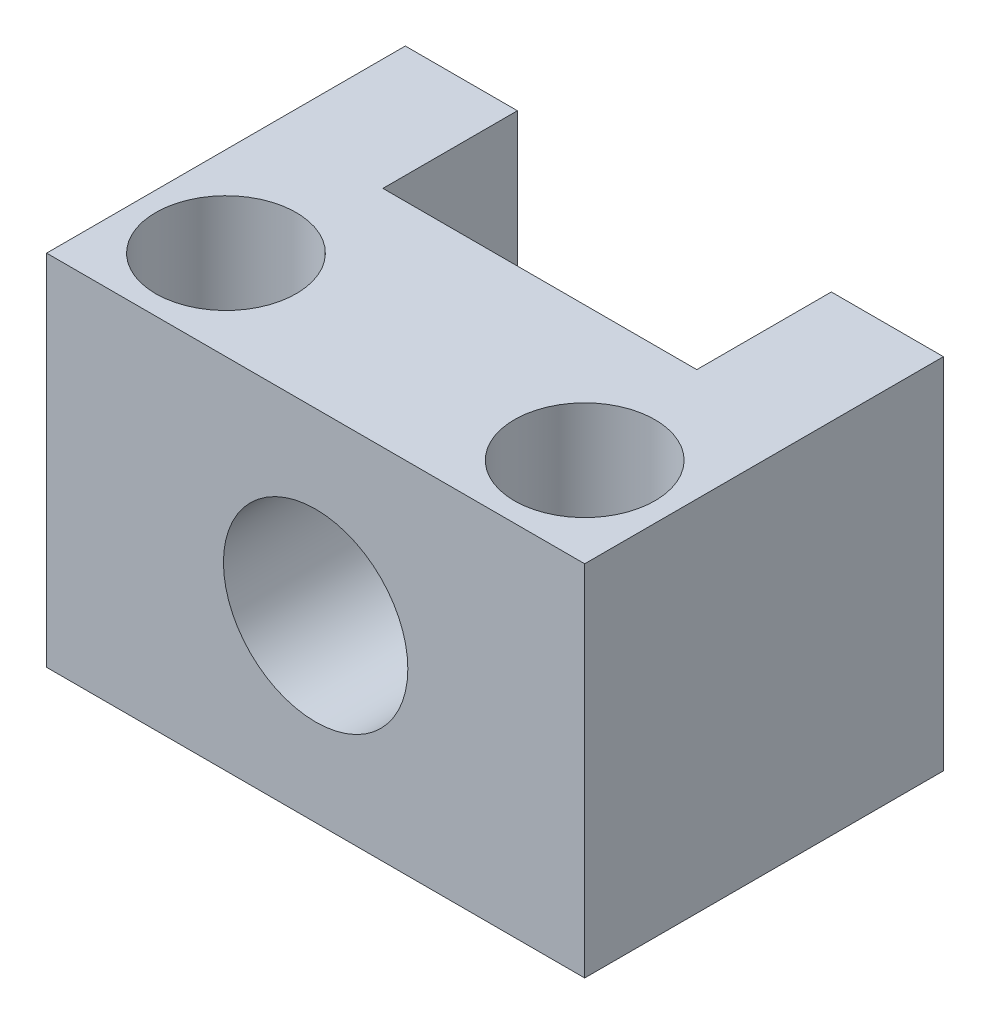
ISO-10303-21;
HEADER;
FILE_DESCRIPTION(('STEP AP214'),'2;1');
FILE_NAME('part.step','',(''),(''),'','','');
FILE_SCHEMA(('AUTOMOTIVE_DESIGN { 1 0 10303 214 1 1 1 1 }'));
ENDSEC;
DATA;
#1=APPLICATION_CONTEXT('core data for automotive mechanical design processes');
#2=APPLICATION_PROTOCOL_DEFINITION('international standard','automotive_design',2000,#1);
#3=PRODUCT_CONTEXT('',#1,'mechanical');
#4=PRODUCT('Part','Part','',(#3));
#5=PRODUCT_RELATED_PRODUCT_CATEGORY('part','',(#4));
#6=PRODUCT_DEFINITION_FORMATION('','',#4);
#7=PRODUCT_DEFINITION_CONTEXT('part definition',#1,'design');
#8=PRODUCT_DEFINITION('design','',#6,#7);
#9=PRODUCT_DEFINITION_SHAPE('','',#8);
#10=(LENGTH_UNIT() NAMED_UNIT(*) SI_UNIT(.MILLI.,.METRE.));
#11=(NAMED_UNIT(*) PLANE_ANGLE_UNIT() SI_UNIT($,.RADIAN.));
#12=(NAMED_UNIT(*) SI_UNIT($,.STERADIAN.) SOLID_ANGLE_UNIT());
#13=UNCERTAINTY_MEASURE_WITH_UNIT(LENGTH_MEASURE(1.E-05),#10,'distance_accuracy_value','');
#14=(GEOMETRIC_REPRESENTATION_CONTEXT(3) GLOBAL_UNCERTAINTY_ASSIGNED_CONTEXT((#13)) GLOBAL_UNIT_ASSIGNED_CONTEXT((#10,
#11,#12)) REPRESENTATION_CONTEXT('',''));
#15=CARTESIAN_POINT('',(0.,0.,0.));
#16=DIRECTION('',(0.,0.,1.));
#17=DIRECTION('',(1.,0.,0.));
#18=AXIS2_PLACEMENT_3D('',#15,#16,#17);
#19=CARTESIAN_POINT('',(0.,12.7,-12.7));
#20=DIRECTION('',(0.,0.,1.));
#21=DIRECTION('',(1.,0.,0.));
#22=AXIS2_PLACEMENT_3D('',#19,#20,#21);
#23=PLANE('',#22);
#24=DIRECTION('',(-1.,0.,0.));
#25=VECTOR('',#24,1.);
#26=CARTESIAN_POINT('',(0.,0.,-12.7));
#27=LINE('',#26,#25);
#28=CARTESIAN_POINT('',(19.05,0.,-12.7));
#29=VERTEX_POINT('',#28);
#30=CARTESIAN_POINT('',(15.08125,0.,-12.7));
#31=VERTEX_POINT('',#30);
#32=EDGE_CURVE('E131',#29,#31,#27,.T.);
#33=ORIENTED_EDGE('',*,*,#32,.T.);
#34=DIRECTION('',(0.,1.,0.));
#35=VECTOR('',#34,1.);
#36=CARTESIAN_POINT('',(15.08125,0.,-12.7));
#37=LINE('',#36,#35);
#38=CARTESIAN_POINT('',(15.08125,12.7,-12.7));
#39=VERTEX_POINT('',#38);
#40=EDGE_CURVE('E115',#31,#39,#37,.T.);
#41=ORIENTED_EDGE('',*,*,#40,.T.);
#42=DIRECTION('',(-1.,0.,0.));
#43=VECTOR('',#42,1.);
#44=CARTESIAN_POINT('',(0.,12.7,-12.7));
#45=LINE('',#44,#43);
#46=CARTESIAN_POINT('',(19.05,12.7,-12.7));
#47=VERTEX_POINT('',#46);
#48=EDGE_CURVE('E148',#47,#39,#45,.T.);
#49=ORIENTED_EDGE('',*,*,#48,.F.);
#50=DIRECTION('',(0.,-1.,0.));
#51=VECTOR('',#50,1.);
#52=CARTESIAN_POINT('',(19.05,12.7,-12.7));
#53=LINE('',#52,#51);
#54=EDGE_CURVE('E138',#47,#29,#53,.T.);
#55=ORIENTED_EDGE('',*,*,#54,.T.);
#56=EDGE_LOOP('',(#33,#41,#49,#55));
#57=FACE_BOUND('',#56,.T.);
#58=ADVANCED_FACE('F39',(#57),#23,.F.);
#59=CARTESIAN_POINT('',(0.,12.7,0.));
#60=DIRECTION('',(1.,0.,0.));
#61=DIRECTION('',(0.,0.,-1.));
#62=AXIS2_PLACEMENT_3D('',#59,#60,#61);
#63=PLANE('',#62);
#64=DIRECTION('',(0.,0.,1.));
#65=VECTOR('',#64,1.);
#66=CARTESIAN_POINT('',(0.,0.,0.));
#67=LINE('',#66,#65);
#68=CARTESIAN_POINT('',(0.,0.,-12.7));
#69=VERTEX_POINT('',#68);
#70=CARTESIAN_POINT('',(0.,0.,0.));
#71=VERTEX_POINT('',#70);
#72=EDGE_CURVE('E157',#69,#71,#67,.T.);
#73=ORIENTED_EDGE('',*,*,#72,.T.);
#74=DIRECTION('',(0.,-1.,0.));
#75=VECTOR('',#74,1.);
#76=CARTESIAN_POINT('',(0.,12.7,0.));
#77=LINE('',#76,#75);
#78=CARTESIAN_POINT('',(0.,12.7,0.));
#79=VERTEX_POINT('',#78);
#80=EDGE_CURVE('E11',#79,#71,#77,.T.);
#81=ORIENTED_EDGE('',*,*,#80,.F.);
#82=DIRECTION('',(0.,0.,1.));
#83=VECTOR('',#82,1.);
#84=CARTESIAN_POINT('',(0.,12.7,0.));
#85=LINE('',#84,#83);
#86=CARTESIAN_POINT('',(0.,12.7,-12.7));
#87=VERTEX_POINT('',#86);
#88=EDGE_CURVE('E139',#87,#79,#85,.T.);
#89=ORIENTED_EDGE('',*,*,#88,.F.);
#90=DIRECTION('',(0.,-1.,0.));
#91=VECTOR('',#90,1.);
#92=CARTESIAN_POINT('',(0.,12.7,-12.7));
#93=LINE('',#92,#91);
#94=EDGE_CURVE('E146',#87,#69,#93,.T.);
#95=ORIENTED_EDGE('',*,*,#94,.T.);
#96=EDGE_LOOP('',(#73,#81,#89,#95));
#97=FACE_BOUND('',#96,.T.);
#98=ADVANCED_FACE('F41',(#97),#63,.F.);
#99=CARTESIAN_POINT('',(0.,12.7,0.));
#100=DIRECTION('',(0.,0.,-1.));
#101=DIRECTION('',(-1.,0.,0.));
#102=AXIS2_PLACEMENT_3D('',#99,#100,#101);
#103=PLANE('',#102);
#104=CARTESIAN_POINT('',(9.525,6.35,0.));
#105=DIRECTION('',(0.,0.,1.));
#106=DIRECTION('',(1.,0.,0.));
#107=AXIS2_PLACEMENT_3D('',#104,#105,#106);
#108=CIRCLE('',#107,3.2639);
#109=CARTESIAN_POINT('',(12.7889,6.35,0.));
#110=VERTEX_POINT('',#109);
#111=EDGE_CURVE('E189',#110,#110,#108,.T.);
#112=ORIENTED_EDGE('',*,*,#111,.F.);
#113=EDGE_LOOP('',(#112));
#114=FACE_BOUND('',#113,.T.);
#115=DIRECTION('',(1.,0.,0.));
#116=VECTOR('',#115,1.);
#117=CARTESIAN_POINT('',(0.,0.,0.));
#118=LINE('',#117,#116);
#119=CARTESIAN_POINT('',(19.05,0.,0.));
#120=VERTEX_POINT('',#119);
#121=EDGE_CURVE('E156',#71,#120,#118,.T.);
#122=ORIENTED_EDGE('',*,*,#121,.T.);
#123=DIRECTION('',(0.,-1.,0.));
#124=VECTOR('',#123,1.);
#125=CARTESIAN_POINT('',(19.05,12.7,0.));
#126=LINE('',#125,#124);
#127=CARTESIAN_POINT('',(19.05,12.7,0.));
#128=VERTEX_POINT('',#127);
#129=EDGE_CURVE('E48',#128,#120,#126,.T.);
#130=ORIENTED_EDGE('',*,*,#129,.F.);
#131=DIRECTION('',(1.,0.,0.));
#132=VECTOR('',#131,1.);
#133=CARTESIAN_POINT('',(0.,12.7,0.));
#134=LINE('',#133,#132);
#135=EDGE_CURVE('E93',#79,#128,#134,.T.);
#136=ORIENTED_EDGE('',*,*,#135,.F.);
#137=ORIENTED_EDGE('',*,*,#80,.T.);
#138=EDGE_LOOP('',(#122,#130,#136,#137));
#139=FACE_BOUND('',#138,.T.);
#140=ADVANCED_FACE('F217',(#114,#139),#103,.F.);
#141=CARTESIAN_POINT('',(19.05,12.7,0.));
#142=DIRECTION('',(-1.,0.,0.));
#143=DIRECTION('',(0.,0.,1.));
#144=AXIS2_PLACEMENT_3D('',#141,#142,#143);
#145=PLANE('',#144);
#146=DIRECTION('',(0.,0.,-1.));
#147=VECTOR('',#146,1.);
#148=CARTESIAN_POINT('',(19.05,0.,0.));
#149=LINE('',#148,#147);
#150=EDGE_CURVE('E142',#120,#29,#149,.T.);
#151=ORIENTED_EDGE('',*,*,#150,.T.);
#152=ORIENTED_EDGE('',*,*,#54,.F.);
#153=DIRECTION('',(0.,0.,-1.));
#154=VECTOR('',#153,1.);
#155=CARTESIAN_POINT('',(19.05,12.7,0.));
#156=LINE('',#155,#154);
#157=EDGE_CURVE('E154',#128,#47,#156,.T.);
#158=ORIENTED_EDGE('',*,*,#157,.F.);
#159=ORIENTED_EDGE('',*,*,#129,.T.);
#160=EDGE_LOOP('',(#151,#152,#158,#159));
#161=FACE_BOUND('',#160,.T.);
#162=ADVANCED_FACE('F153',(#161),#145,.F.);
#163=CARTESIAN_POINT('',(3.96875,12.7,-12.7));
#164=VERTEX_POINT('',#163);
#165=EDGE_CURVE('E64',#164,#87,#45,.T.);
#166=ORIENTED_EDGE('',*,*,#165,.F.);
#167=DIRECTION('',(0.,1.,0.));
#168=VECTOR('',#167,1.);
#169=CARTESIAN_POINT('',(3.96875,0.,-12.7));
#170=LINE('',#169,#168);
#171=CARTESIAN_POINT('',(3.96875,0.,-12.7));
#172=VERTEX_POINT('',#171);
#173=EDGE_CURVE('E125',#172,#164,#170,.T.);
#174=ORIENTED_EDGE('',*,*,#173,.F.);
#175=EDGE_CURVE('E86',#172,#69,#27,.T.);
#176=ORIENTED_EDGE('',*,*,#175,.T.);
#177=ORIENTED_EDGE('',*,*,#94,.F.);
#178=EDGE_LOOP('',(#166,#174,#176,#177));
#179=FACE_BOUND('',#178,.T.);
#180=ADVANCED_FACE('F211',(#179),#23,.F.);
#181=CARTESIAN_POINT('',(0.,12.7,0.));
#182=DIRECTION('',(0.,-1.,0.));
#183=DIRECTION('',(0.,0.,-1.));
#184=AXIS2_PLACEMENT_3D('',#181,#182,#183);
#185=PLANE('',#184);
#186=CARTESIAN_POINT('',(15.875,12.7,-3.175));
#187=DIRECTION('',(0.,1.,0.));
#188=DIRECTION('',(0.,0.,1.));
#189=AXIS2_PLACEMENT_3D('',#186,#187,#188);
#190=CIRCLE('',#189,2.4892);
#191=CARTESIAN_POINT('',(15.875,12.7,-0.685800000000002));
#192=VERTEX_POINT('',#191);
#193=EDGE_CURVE('E184',#192,#192,#190,.T.);
#194=ORIENTED_EDGE('',*,*,#193,.F.);
#195=EDGE_LOOP('',(#194));
#196=FACE_BOUND('',#195,.T.);
#197=CARTESIAN_POINT('',(3.175,12.7,-3.175));
#198=DIRECTION('',(0.,1.,0.));
#199=DIRECTION('',(0.,0.,1.));
#200=AXIS2_PLACEMENT_3D('',#197,#198,#199);
#201=CIRCLE('',#200,2.4892);
#202=CARTESIAN_POINT('',(3.175,12.7,-0.685800000000002));
#203=VERTEX_POINT('',#202);
#204=EDGE_CURVE('E178',#203,#203,#201,.T.);
#205=ORIENTED_EDGE('',*,*,#204,.F.);
#206=EDGE_LOOP('',(#205));
#207=FACE_BOUND('',#206,.T.);
#208=ORIENTED_EDGE('',*,*,#48,.T.);
#209=DIRECTION('',(0.,0.,-1.));
#210=VECTOR('',#209,1.);
#211=CARTESIAN_POINT('',(15.08125,12.7,-7.9375));
#212=LINE('',#211,#210);
#213=CARTESIAN_POINT('',(15.08125,12.7,-7.9375));
#214=VERTEX_POINT('',#213);
#215=EDGE_CURVE('E120',#214,#39,#212,.T.);
#216=ORIENTED_EDGE('',*,*,#215,.F.);
#217=DIRECTION('',(1.,0.,0.));
#218=VECTOR('',#217,1.);
#219=CARTESIAN_POINT('',(3.96875,12.7,-7.9375));
#220=LINE('',#219,#218);
#221=CARTESIAN_POINT('',(3.96875,12.7,-7.9375));
#222=VERTEX_POINT('',#221);
#223=EDGE_CURVE('E134',#222,#214,#220,.T.);
#224=ORIENTED_EDGE('',*,*,#223,.F.);
#225=DIRECTION('',(0.,0.,1.));
#226=VECTOR('',#225,1.);
#227=CARTESIAN_POINT('',(3.96875,12.7,-7.9375));
#228=LINE('',#227,#226);
#229=EDGE_CURVE('E171',#164,#222,#228,.T.);
#230=ORIENTED_EDGE('',*,*,#229,.F.);
#231=ORIENTED_EDGE('',*,*,#165,.T.);
#232=ORIENTED_EDGE('',*,*,#88,.T.);
#233=ORIENTED_EDGE('',*,*,#135,.T.);
#234=ORIENTED_EDGE('',*,*,#157,.T.);
#235=EDGE_LOOP('',(#208,#216,#224,#230,#231,#232,#233,#234));
#236=FACE_BOUND('',#235,.T.);
#237=ADVANCED_FACE('F221',(#196,#207,#236),#185,.F.);
#238=CARTESIAN_POINT('',(0.,0.,0.));
#239=DIRECTION('',(0.,-1.,0.));
#240=DIRECTION('',(0.,0.,-1.));
#241=AXIS2_PLACEMENT_3D('',#238,#239,#240);
#242=PLANE('',#241);
#243=CARTESIAN_POINT('',(15.875,0.,-3.175));
#244=DIRECTION('',(0.,1.,0.));
#245=DIRECTION('',(0.,0.,1.));
#246=AXIS2_PLACEMENT_3D('',#243,#244,#245);
#247=CIRCLE('',#246,2.4892);
#248=CARTESIAN_POINT('',(15.875,0.,-0.685800000000002));
#249=VERTEX_POINT('',#248);
#250=EDGE_CURVE('E181',#249,#249,#247,.T.);
#251=ORIENTED_EDGE('',*,*,#250,.T.);
#252=EDGE_LOOP('',(#251));
#253=FACE_BOUND('',#252,.T.);
#254=CARTESIAN_POINT('',(3.175,0.,-3.175));
#255=DIRECTION('',(0.,1.,0.));
#256=DIRECTION('',(0.,0.,1.));
#257=AXIS2_PLACEMENT_3D('',#254,#255,#256);
#258=CIRCLE('',#257,2.4892);
#259=CARTESIAN_POINT('',(3.175,0.,-0.685800000000002));
#260=VERTEX_POINT('',#259);
#261=EDGE_CURVE('E175',#260,#260,#258,.T.);
#262=ORIENTED_EDGE('',*,*,#261,.T.);
#263=EDGE_LOOP('',(#262));
#264=FACE_BOUND('',#263,.T.);
#265=DIRECTION('',(0.,0.,-1.));
#266=VECTOR('',#265,1.);
#267=CARTESIAN_POINT('',(15.08125,0.,-7.9375));
#268=LINE('',#267,#266);
#269=CARTESIAN_POINT('',(15.08125,0.,-7.9375));
#270=VERTEX_POINT('',#269);
#271=EDGE_CURVE('E118',#270,#31,#268,.T.);
#272=ORIENTED_EDGE('',*,*,#271,.T.);
#273=ORIENTED_EDGE('',*,*,#32,.F.);
#274=ORIENTED_EDGE('',*,*,#150,.F.);
#275=ORIENTED_EDGE('',*,*,#121,.F.);
#276=ORIENTED_EDGE('',*,*,#72,.F.);
#277=ORIENTED_EDGE('',*,*,#175,.F.);
#278=DIRECTION('',(0.,0.,1.));
#279=VECTOR('',#278,1.);
#280=CARTESIAN_POINT('',(3.96875,0.,-7.9375));
#281=LINE('',#280,#279);
#282=CARTESIAN_POINT('',(3.96875,0.,-7.9375));
#283=VERTEX_POINT('',#282);
#284=EDGE_CURVE('E133',#172,#283,#281,.T.);
#285=ORIENTED_EDGE('',*,*,#284,.T.);
#286=DIRECTION('',(1.,0.,0.));
#287=VECTOR('',#286,1.);
#288=CARTESIAN_POINT('',(3.96875,0.,-7.9375));
#289=LINE('',#288,#287);
#290=EDGE_CURVE('E55',#283,#270,#289,.T.);
#291=ORIENTED_EDGE('',*,*,#290,.T.);
#292=EDGE_LOOP('',(#272,#273,#274,#275,#276,#277,#285,#291));
#293=FACE_BOUND('',#292,.T.);
#294=ADVANCED_FACE('F129',(#253,#264,#293),#242,.T.);
#295=CARTESIAN_POINT('',(15.08125,0.,-7.9375));
#296=DIRECTION('',(1.,0.,0.));
#297=DIRECTION('',(0.,0.,-1.));
#298=AXIS2_PLACEMENT_3D('',#295,#296,#297);
#299=PLANE('',#298);
#300=ORIENTED_EDGE('',*,*,#215,.T.);
#301=ORIENTED_EDGE('',*,*,#40,.F.);
#302=ORIENTED_EDGE('',*,*,#271,.F.);
#303=DIRECTION('',(0.,1.,0.));
#304=VECTOR('',#303,1.);
#305=CARTESIAN_POINT('',(15.08125,0.,-7.9375));
#306=LINE('',#305,#304);
#307=EDGE_CURVE('E159',#270,#214,#306,.T.);
#308=ORIENTED_EDGE('',*,*,#307,.T.);
#309=EDGE_LOOP('',(#300,#301,#302,#308));
#310=FACE_BOUND('',#309,.T.);
#311=ADVANCED_FACE('F117',(#310),#299,.F.);
#312=CARTESIAN_POINT('',(3.96875,0.,-7.9375));
#313=DIRECTION('',(0.,0.,1.));
#314=DIRECTION('',(1.,0.,0.));
#315=AXIS2_PLACEMENT_3D('',#312,#313,#314);
#316=PLANE('',#315);
#317=CARTESIAN_POINT('',(9.525,6.35,-7.9375));
#318=DIRECTION('',(0.,0.,1.));
#319=DIRECTION('',(1.,0.,0.));
#320=AXIS2_PLACEMENT_3D('',#317,#318,#319);
#321=CIRCLE('',#320,3.2639);
#322=CARTESIAN_POINT('',(12.7889,6.35,-7.9375));
#323=VERTEX_POINT('',#322);
#324=EDGE_CURVE('E43',#323,#323,#321,.T.);
#325=ORIENTED_EDGE('',*,*,#324,.T.);
#326=EDGE_LOOP('',(#325));
#327=FACE_BOUND('',#326,.T.);
#328=ORIENTED_EDGE('',*,*,#223,.T.);
#329=ORIENTED_EDGE('',*,*,#307,.F.);
#330=ORIENTED_EDGE('',*,*,#290,.F.);
#331=DIRECTION('',(0.,1.,0.));
#332=VECTOR('',#331,1.);
#333=CARTESIAN_POINT('',(3.96875,0.,-7.9375));
#334=LINE('',#333,#332);
#335=EDGE_CURVE('E166',#283,#222,#334,.T.);
#336=ORIENTED_EDGE('',*,*,#335,.T.);
#337=EDGE_LOOP('',(#328,#329,#330,#336));
#338=FACE_BOUND('',#337,.T.);
#339=ADVANCED_FACE('F196',(#327,#338),#316,.F.);
#340=CARTESIAN_POINT('',(3.96875,0.,-7.9375));
#341=DIRECTION('',(-1.,0.,0.));
#342=DIRECTION('',(0.,0.,1.));
#343=AXIS2_PLACEMENT_3D('',#340,#341,#342);
#344=PLANE('',#343);
#345=ORIENTED_EDGE('',*,*,#229,.T.);
#346=ORIENTED_EDGE('',*,*,#335,.F.);
#347=ORIENTED_EDGE('',*,*,#284,.F.);
#348=ORIENTED_EDGE('',*,*,#173,.T.);
#349=EDGE_LOOP('',(#345,#346,#347,#348));
#350=FACE_BOUND('',#349,.T.);
#351=ADVANCED_FACE('F231',(#350),#344,.F.);
#352=CARTESIAN_POINT('',(3.175,0.,-3.175));
#353=DIRECTION('',(0.,1.,0.));
#354=DIRECTION('',(0.,0.,1.));
#355=AXIS2_PLACEMENT_3D('',#352,#353,#354);
#356=CYLINDRICAL_SURFACE('',#355,2.4892);
#357=ORIENTED_EDGE('',*,*,#261,.F.);
#358=EDGE_LOOP('',(#357));
#359=FACE_BOUND('',#358,.T.);
#360=ORIENTED_EDGE('',*,*,#204,.T.);
#361=EDGE_LOOP('',(#360));
#362=FACE_BOUND('',#361,.T.);
#363=ADVANCED_FACE('F206',(#359,#362),#356,.F.);
#364=CARTESIAN_POINT('',(15.875,0.,-3.175));
#365=DIRECTION('',(0.,1.,0.));
#366=DIRECTION('',(0.,0.,1.));
#367=AXIS2_PLACEMENT_3D('',#364,#365,#366);
#368=CYLINDRICAL_SURFACE('',#367,2.4892);
#369=ORIENTED_EDGE('',*,*,#250,.F.);
#370=EDGE_LOOP('',(#369));
#371=FACE_BOUND('',#370,.T.);
#372=ORIENTED_EDGE('',*,*,#193,.T.);
#373=EDGE_LOOP('',(#372));
#374=FACE_BOUND('',#373,.T.);
#375=ADVANCED_FACE('F200',(#371,#374),#368,.F.);
#376=CARTESIAN_POINT('',(9.525,6.35,-12.7));
#377=DIRECTION('',(0.,0.,1.));
#378=DIRECTION('',(1.,0.,0.));
#379=AXIS2_PLACEMENT_3D('',#376,#377,#378);
#380=CYLINDRICAL_SURFACE('',#379,3.2639);
#381=ORIENTED_EDGE('',*,*,#111,.T.);
#382=EDGE_LOOP('',(#381));
#383=FACE_BOUND('',#382,.T.);
#384=ORIENTED_EDGE('',*,*,#324,.F.);
#385=EDGE_LOOP('',(#384));
#386=FACE_BOUND('',#385,.T.);
#387=ADVANCED_FACE('F198',(#383,#386),#380,.F.);
#388=CLOSED_SHELL('',(#58,#98,#140,#162,#180,#237,#294,#311,#339,#351,#363,#375,#387));
#389=MANIFOLD_SOLID_BREP('B2',#388);
#390=ADVANCED_BREP_SHAPE_REPRESENTATION('',(#18,#389),#14);
#391=SHAPE_DEFINITION_REPRESENTATION(#9,#390);
ENDSEC;
END-ISO-10303-21;
